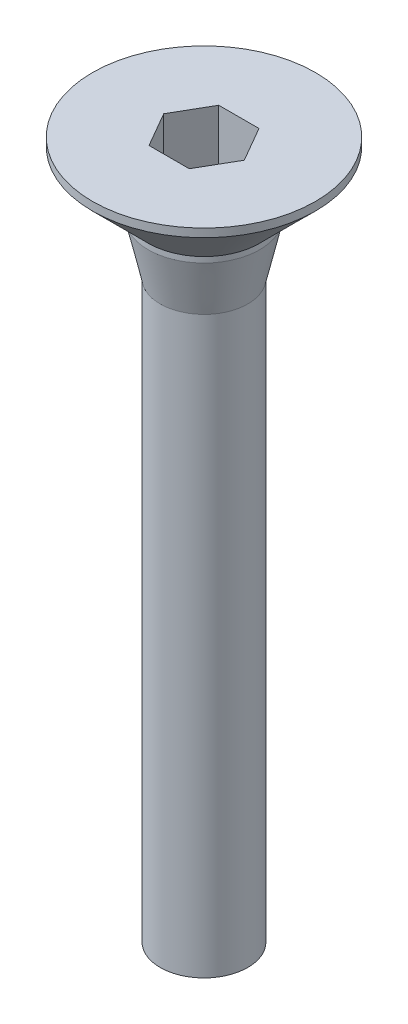
ISO-10303-21;
HEADER;
FILE_DESCRIPTION(('STEP AP214'),'2;1');
FILE_NAME('part.step','',(''),(''),'','','');
FILE_SCHEMA(('AUTOMOTIVE_DESIGN { 1 0 10303 214 1 1 1 1 }'));
ENDSEC;
DATA;
#1=APPLICATION_CONTEXT('core data for automotive mechanical design processes');
#2=APPLICATION_PROTOCOL_DEFINITION('international standard','automotive_design',2000,#1);
#3=PRODUCT_CONTEXT('',#1,'mechanical');
#4=PRODUCT('Part','Part','',(#3));
#5=PRODUCT_RELATED_PRODUCT_CATEGORY('part','',(#4));
#6=PRODUCT_DEFINITION_FORMATION('','',#4);
#7=PRODUCT_DEFINITION_CONTEXT('part definition',#1,'design');
#8=PRODUCT_DEFINITION('design','',#6,#7);
#9=PRODUCT_DEFINITION_SHAPE('','',#8);
#10=(LENGTH_UNIT() NAMED_UNIT(*) SI_UNIT(.MILLI.,.METRE.));
#11=(NAMED_UNIT(*) PLANE_ANGLE_UNIT() SI_UNIT($,.RADIAN.));
#12=(NAMED_UNIT(*) SI_UNIT($,.STERADIAN.) SOLID_ANGLE_UNIT());
#13=UNCERTAINTY_MEASURE_WITH_UNIT(LENGTH_MEASURE(1.E-05),#10,'distance_accuracy_value','');
#14=(GEOMETRIC_REPRESENTATION_CONTEXT(3) GLOBAL_UNCERTAINTY_ASSIGNED_CONTEXT((#13)) GLOBAL_UNIT_ASSIGNED_CONTEXT((#10,
#11,#12)) REPRESENTATION_CONTEXT('',''));
#15=CARTESIAN_POINT('',(0.,0.,0.));
#16=DIRECTION('',(0.,0.,1.));
#17=DIRECTION('',(1.,0.,0.));
#18=AXIS2_PLACEMENT_3D('',#15,#16,#17);
#19=CARTESIAN_POINT('',(1.5705,-25.,0.));
#20=DIRECTION('',(0.,1.,0.));
#21=DIRECTION('',(-1.,0.,0.));
#22=AXIS2_PLACEMENT_3D('',#19,#20,#21);
#23=PLANE('',#22);
#24=CARTESIAN_POINT('',(0.,-25.,0.));
#25=DIRECTION('',(0.,1.,0.));
#26=DIRECTION('',(-1.,0.,0.));
#27=AXIS2_PLACEMENT_3D('',#24,#25,#26);
#28=CIRCLE('',#27,1.5705);
#29=CARTESIAN_POINT('',(-1.5705,-25.,0.));
#30=VERTEX_POINT('',#29);
#31=EDGE_CURVE('E11',#30,#30,#28,.T.);
#32=ORIENTED_EDGE('',*,*,#31,.F.);
#33=EDGE_LOOP('',(#32));
#34=FACE_BOUND('',#33,.T.);
#35=ADVANCED_FACE('F33',(#34),#23,.F.);
#36=CARTESIAN_POINT('',(0.,0.,0.));
#37=DIRECTION('',(0.,1.,0.));
#38=DIRECTION('',(-1.,0.,0.));
#39=AXIS2_PLACEMENT_3D('',#36,#37,#38);
#40=CYLINDRICAL_SURFACE('',#39,1.5705);
#41=CARTESIAN_POINT('',(0.,-4.4,0.));
#42=DIRECTION('',(0.,1.,0.));
#43=DIRECTION('',(-1.,0.,0.));
#44=AXIS2_PLACEMENT_3D('',#41,#42,#43);
#45=CIRCLE('',#44,1.5705);
#46=CARTESIAN_POINT('',(-1.5705,-4.4,0.));
#47=VERTEX_POINT('',#46);
#48=EDGE_CURVE('E40',#47,#47,#45,.T.);
#49=ORIENTED_EDGE('',*,*,#48,.F.);
#50=EDGE_LOOP('',(#49));
#51=FACE_BOUND('',#50,.T.);
#52=ORIENTED_EDGE('',*,*,#31,.T.);
#53=EDGE_LOOP('',(#52));
#54=FACE_BOUND('',#53,.T.);
#55=ADVANCED_FACE('F155',(#51,#54),#40,.T.);
#56=CARTESIAN_POINT('',(0.,-4.4,0.));
#57=DIRECTION('',(0.,1.,0.));
#58=DIRECTION('',(-1.,0.,0.));
#59=AXIS2_PLACEMENT_3D('',#56,#57,#58);
#60=CONICAL_SURFACE('',#59,1.5705,0.222316126094133);
#61=CARTESIAN_POINT('',(0.,-2.5,0.));
#62=DIRECTION('',(0.,1.,0.));
#63=DIRECTION('',(-1.,0.,0.));
#64=AXIS2_PLACEMENT_3D('',#61,#62,#63);
#65=CIRCLE('',#64,2.);
#66=CARTESIAN_POINT('',(-2.,-2.5,0.));
#67=VERTEX_POINT('',#66);
#68=EDGE_CURVE('E148',#67,#67,#65,.T.);
#69=ORIENTED_EDGE('',*,*,#68,.F.);
#70=EDGE_LOOP('',(#69));
#71=FACE_BOUND('',#70,.T.);
#72=ORIENTED_EDGE('',*,*,#48,.T.);
#73=EDGE_LOOP('',(#72));
#74=FACE_BOUND('',#73,.T.);
#75=ADVANCED_FACE('F153',(#71,#74),#60,.T.);
#76=CARTESIAN_POINT('',(0.,0.,0.));
#77=DIRECTION('',(0.,1.,0.));
#78=DIRECTION('',(-1.,0.,0.));
#79=AXIS2_PLACEMENT_3D('',#76,#77,#78);
#80=CYLINDRICAL_SURFACE('',#79,2.);
#81=CARTESIAN_POINT('',(0.,-2.3,0.));
#82=DIRECTION('',(0.,1.,0.));
#83=DIRECTION('',(-1.,0.,0.));
#84=AXIS2_PLACEMENT_3D('',#81,#82,#83);
#85=CIRCLE('',#84,2.);
#86=CARTESIAN_POINT('',(-2.,-2.3,0.));
#87=VERTEX_POINT('',#86);
#88=EDGE_CURVE('E145',#87,#87,#85,.T.);
#89=ORIENTED_EDGE('',*,*,#88,.F.);
#90=EDGE_LOOP('',(#89));
#91=FACE_BOUND('',#90,.T.);
#92=ORIENTED_EDGE('',*,*,#68,.T.);
#93=EDGE_LOOP('',(#92));
#94=FACE_BOUND('',#93,.T.);
#95=ADVANCED_FACE('F173',(#91,#94),#80,.T.);
#96=CARTESIAN_POINT('',(0.,-2.3,0.));
#97=DIRECTION('',(0.,1.,0.));
#98=DIRECTION('',(-1.,0.,0.));
#99=AXIS2_PLACEMENT_3D('',#96,#97,#98);
#100=CONICAL_SURFACE('',#99,2.,0.785398163397442);
#101=CARTESIAN_POINT('',(0.,-0.299999999999975,0.));
#102=DIRECTION('',(0.,1.,0.));
#103=DIRECTION('',(-1.,0.,0.));
#104=AXIS2_PLACEMENT_3D('',#101,#102,#103);
#105=CIRCLE('',#104,4.);
#106=CARTESIAN_POINT('',(-4.,-0.299999999999976,0.));
#107=VERTEX_POINT('',#106);
#108=EDGE_CURVE('E142',#107,#107,#105,.T.);
#109=ORIENTED_EDGE('',*,*,#108,.F.);
#110=EDGE_LOOP('',(#109));
#111=FACE_BOUND('',#110,.T.);
#112=ORIENTED_EDGE('',*,*,#88,.T.);
#113=EDGE_LOOP('',(#112));
#114=FACE_BOUND('',#113,.T.);
#115=ADVANCED_FACE('F181',(#111,#114),#100,.T.);
#116=CARTESIAN_POINT('',(0.,0.,0.));
#117=DIRECTION('',(0.,1.,0.));
#118=DIRECTION('',(-1.,0.,0.));
#119=AXIS2_PLACEMENT_3D('',#116,#117,#118);
#120=CYLINDRICAL_SURFACE('',#119,4.);
#121=CARTESIAN_POINT('',(0.,0.,0.));
#122=DIRECTION('',(0.,1.,0.));
#123=DIRECTION('',(-1.,0.,0.));
#124=AXIS2_PLACEMENT_3D('',#121,#122,#123);
#125=CIRCLE('',#124,4.);
#126=CARTESIAN_POINT('',(-4.,0.,0.));
#127=VERTEX_POINT('',#126);
#128=EDGE_CURVE('E134',#127,#127,#125,.T.);
#129=ORIENTED_EDGE('',*,*,#128,.F.);
#130=EDGE_LOOP('',(#129));
#131=FACE_BOUND('',#130,.T.);
#132=ORIENTED_EDGE('',*,*,#108,.T.);
#133=EDGE_LOOP('',(#132));
#134=FACE_BOUND('',#133,.T.);
#135=ADVANCED_FACE('F189',(#131,#134),#120,.T.);
#136=CARTESIAN_POINT('',(0.,0.,0.));
#137=DIRECTION('',(0.,-1.,0.));
#138=DIRECTION('',(1.,0.,0.));
#139=AXIS2_PLACEMENT_3D('',#136,#137,#138);
#140=PLANE('',#139);
#141=DIRECTION('',(1.,0.,0.));
#142=VECTOR('',#141,1.);
#143=CARTESIAN_POINT('',(-0.721687836487031,0.,1.25));
#144=LINE('',#143,#142);
#145=CARTESIAN_POINT('',(-0.721687836487031,0.,1.25));
#146=VERTEX_POINT('',#145);
#147=CARTESIAN_POINT('',(0.721687836487031,0.,1.25));
#148=VERTEX_POINT('',#147);
#149=EDGE_CURVE('E121',#146,#148,#144,.T.);
#150=ORIENTED_EDGE('',*,*,#149,.F.);
#151=DIRECTION('',(0.499999999999998,0.,0.86602540378444));
#152=VECTOR('',#151,1.);
#153=CARTESIAN_POINT('',(-0.721687836487031,0.,1.25));
#154=LINE('',#153,#152);
#155=CARTESIAN_POINT('',(-1.44337567297406,0.,0.));
#156=VERTEX_POINT('',#155);
#157=EDGE_CURVE('E47',#156,#146,#154,.T.);
#158=ORIENTED_EDGE('',*,*,#157,.F.);
#159=DIRECTION('',(-0.499999999999998,0.,0.86602540378444));
#160=VECTOR('',#159,1.);
#161=CARTESIAN_POINT('',(-0.721687836487031,0.,-1.25));
#162=LINE('',#161,#160);
#163=CARTESIAN_POINT('',(-0.721687836487031,0.,-1.25));
#164=VERTEX_POINT('',#163);
#165=EDGE_CURVE('E130',#164,#156,#162,.T.);
#166=ORIENTED_EDGE('',*,*,#165,.F.);
#167=DIRECTION('',(-1.,0.,0.));
#168=VECTOR('',#167,1.);
#169=CARTESIAN_POINT('',(-0.721687836487031,0.,-1.25));
#170=LINE('',#169,#168);
#171=CARTESIAN_POINT('',(0.721687836487031,0.,-1.25));
#172=VERTEX_POINT('',#171);
#173=EDGE_CURVE('E128',#172,#164,#170,.T.);
#174=ORIENTED_EDGE('',*,*,#173,.F.);
#175=DIRECTION('',(-0.499999999999998,0.,-0.86602540378444));
#176=VECTOR('',#175,1.);
#177=CARTESIAN_POINT('',(0.721687836487031,0.,-1.25));
#178=LINE('',#177,#176);
#179=CARTESIAN_POINT('',(1.44337567297406,0.,0.));
#180=VERTEX_POINT('',#179);
#181=EDGE_CURVE('E95',#180,#172,#178,.T.);
#182=ORIENTED_EDGE('',*,*,#181,.F.);
#183=DIRECTION('',(0.499999999999998,0.,-0.86602540378444));
#184=VECTOR('',#183,1.);
#185=CARTESIAN_POINT('',(0.721687836487031,0.,1.25));
#186=LINE('',#185,#184);
#187=EDGE_CURVE('E124',#148,#180,#186,.T.);
#188=ORIENTED_EDGE('',*,*,#187,.F.);
#189=EDGE_LOOP('',(#150,#158,#166,#174,#182,#188));
#190=FACE_BOUND('',#189,.T.);
#191=ORIENTED_EDGE('',*,*,#128,.T.);
#192=EDGE_LOOP('',(#191));
#193=FACE_BOUND('',#192,.T.);
#194=ADVANCED_FACE('F197',(#190,#193),#140,.F.);
#195=CARTESIAN_POINT('',(-0.721687836487031,-5.3,1.25));
#196=DIRECTION('',(-0.86602540378444,0.,0.499999999999998));
#197=DIRECTION('',(0.499999999999998,0.,0.86602540378444));
#198=AXIS2_PLACEMENT_3D('',#195,#196,#197);
#199=PLANE('',#198);
#200=ORIENTED_EDGE('',*,*,#157,.T.);
#201=DIRECTION('',(0.,1.,0.));
#202=VECTOR('',#201,1.);
#203=CARTESIAN_POINT('',(-0.721687836487031,-5.3,1.25));
#204=LINE('',#203,#202);
#205=CARTESIAN_POINT('',(-0.721687836487031,-5.3,1.25));
#206=VERTEX_POINT('',#205);
#207=EDGE_CURVE('E77',#206,#146,#204,.T.);
#208=ORIENTED_EDGE('',*,*,#207,.F.);
#209=DIRECTION('',(0.499999999999998,0.,0.86602540378444));
#210=VECTOR('',#209,1.);
#211=CARTESIAN_POINT('',(-0.721687836487031,-5.3,1.25));
#212=LINE('',#211,#210);
#213=CARTESIAN_POINT('',(-1.44337567297406,-5.3,0.));
#214=VERTEX_POINT('',#213);
#215=EDGE_CURVE('E132',#214,#206,#212,.T.);
#216=ORIENTED_EDGE('',*,*,#215,.F.);
#217=DIRECTION('',(0.,1.,0.));
#218=VECTOR('',#217,1.);
#219=CARTESIAN_POINT('',(-1.44337567297406,-5.3,0.));
#220=LINE('',#219,#218);
#221=EDGE_CURVE('E55',#214,#156,#220,.T.);
#222=ORIENTED_EDGE('',*,*,#221,.T.);
#223=EDGE_LOOP('',(#200,#208,#216,#222));
#224=FACE_BOUND('',#223,.T.);
#225=ADVANCED_FACE('F205',(#224),#199,.F.);
#226=CARTESIAN_POINT('',(-0.721687836487031,-5.3,-1.25));
#227=DIRECTION('',(-0.86602540378444,0.,-0.499999999999998));
#228=DIRECTION('',(-0.499999999999998,0.,0.86602540378444));
#229=AXIS2_PLACEMENT_3D('',#226,#227,#228);
#230=PLANE('',#229);
#231=ORIENTED_EDGE('',*,*,#165,.T.);
#232=ORIENTED_EDGE('',*,*,#221,.F.);
#233=DIRECTION('',(-0.499999999999998,0.,0.86602540378444));
#234=VECTOR('',#233,1.);
#235=CARTESIAN_POINT('',(-0.721687836487031,-5.3,-1.25));
#236=LINE('',#235,#234);
#237=CARTESIAN_POINT('',(-0.721687836487031,-5.3,-1.25));
#238=VERTEX_POINT('',#237);
#239=EDGE_CURVE('E107',#238,#214,#236,.T.);
#240=ORIENTED_EDGE('',*,*,#239,.F.);
#241=DIRECTION('',(0.,1.,0.));
#242=VECTOR('',#241,1.);
#243=CARTESIAN_POINT('',(-0.721687836487031,-5.3,-1.25));
#244=LINE('',#243,#242);
#245=EDGE_CURVE('E99',#238,#164,#244,.T.);
#246=ORIENTED_EDGE('',*,*,#245,.T.);
#247=EDGE_LOOP('',(#231,#232,#240,#246));
#248=FACE_BOUND('',#247,.T.);
#249=ADVANCED_FACE('F213',(#248),#230,.F.);
#250=CARTESIAN_POINT('',(-0.721687836487031,-5.3,-1.25));
#251=DIRECTION('',(0.,0.,-1.));
#252=DIRECTION('',(-1.,0.,0.));
#253=AXIS2_PLACEMENT_3D('',#250,#251,#252);
#254=PLANE('',#253);
#255=ORIENTED_EDGE('',*,*,#173,.T.);
#256=ORIENTED_EDGE('',*,*,#245,.F.);
#257=DIRECTION('',(-1.,0.,0.));
#258=VECTOR('',#257,1.);
#259=CARTESIAN_POINT('',(-0.721687836487031,-5.3,-1.25));
#260=LINE('',#259,#258);
#261=CARTESIAN_POINT('',(0.721687836487031,-5.3,-1.25));
#262=VERTEX_POINT('',#261);
#263=EDGE_CURVE('E103',#262,#238,#260,.T.);
#264=ORIENTED_EDGE('',*,*,#263,.F.);
#265=DIRECTION('',(0.,1.,0.));
#266=VECTOR('',#265,1.);
#267=CARTESIAN_POINT('',(0.721687836487031,-5.3,-1.25));
#268=LINE('',#267,#266);
#269=EDGE_CURVE('E88',#262,#172,#268,.T.);
#270=ORIENTED_EDGE('',*,*,#269,.T.);
#271=EDGE_LOOP('',(#255,#256,#264,#270));
#272=FACE_BOUND('',#271,.T.);
#273=ADVANCED_FACE('F104',(#272),#254,.F.);
#274=CARTESIAN_POINT('',(0.721687836487031,-5.3,-1.25));
#275=DIRECTION('',(0.86602540378444,0.,-0.499999999999998));
#276=DIRECTION('',(-0.499999999999998,0.,-0.86602540378444));
#277=AXIS2_PLACEMENT_3D('',#274,#275,#276);
#278=PLANE('',#277);
#279=ORIENTED_EDGE('',*,*,#181,.T.);
#280=ORIENTED_EDGE('',*,*,#269,.F.);
#281=DIRECTION('',(-0.499999999999998,0.,-0.86602540378444));
#282=VECTOR('',#281,1.);
#283=CARTESIAN_POINT('',(0.721687836487031,-5.3,-1.25));
#284=LINE('',#283,#282);
#285=CARTESIAN_POINT('',(1.44337567297406,-5.3,0.));
#286=VERTEX_POINT('',#285);
#287=EDGE_CURVE('E92',#286,#262,#284,.T.);
#288=ORIENTED_EDGE('',*,*,#287,.F.);
#289=DIRECTION('',(0.,1.,0.));
#290=VECTOR('',#289,1.);
#291=CARTESIAN_POINT('',(1.44337567297406,-5.3,0.));
#292=LINE('',#291,#290);
#293=EDGE_CURVE('E100',#286,#180,#292,.T.);
#294=ORIENTED_EDGE('',*,*,#293,.T.);
#295=EDGE_LOOP('',(#279,#280,#288,#294));
#296=FACE_BOUND('',#295,.T.);
#297=ADVANCED_FACE('F90',(#296),#278,.F.);
#298=CARTESIAN_POINT('',(0.721687836487031,-5.3,1.25));
#299=DIRECTION('',(0.86602540378444,0.,0.499999999999998));
#300=DIRECTION('',(0.499999999999998,0.,-0.86602540378444));
#301=AXIS2_PLACEMENT_3D('',#298,#299,#300);
#302=PLANE('',#301);
#303=ORIENTED_EDGE('',*,*,#187,.T.);
#304=ORIENTED_EDGE('',*,*,#293,.F.);
#305=DIRECTION('',(0.499999999999998,0.,-0.86602540378444));
#306=VECTOR('',#305,1.);
#307=CARTESIAN_POINT('',(0.721687836487031,-5.3,1.25));
#308=LINE('',#307,#306);
#309=CARTESIAN_POINT('',(0.721687836487031,-5.3,1.25));
#310=VERTEX_POINT('',#309);
#311=EDGE_CURVE('E113',#310,#286,#308,.T.);
#312=ORIENTED_EDGE('',*,*,#311,.F.);
#313=DIRECTION('',(0.,1.,0.));
#314=VECTOR('',#313,1.);
#315=CARTESIAN_POINT('',(0.721687836487031,-5.3,1.25));
#316=LINE('',#315,#314);
#317=EDGE_CURVE('E137',#310,#148,#316,.T.);
#318=ORIENTED_EDGE('',*,*,#317,.T.);
#319=EDGE_LOOP('',(#303,#304,#312,#318));
#320=FACE_BOUND('',#319,.T.);
#321=ADVANCED_FACE('F232',(#320),#302,.F.);
#322=CARTESIAN_POINT('',(-0.721687836487031,-5.3,1.25));
#323=DIRECTION('',(0.,0.,1.));
#324=DIRECTION('',(1.,0.,0.));
#325=AXIS2_PLACEMENT_3D('',#322,#323,#324);
#326=PLANE('',#325);
#327=ORIENTED_EDGE('',*,*,#149,.T.);
#328=ORIENTED_EDGE('',*,*,#317,.F.);
#329=DIRECTION('',(1.,0.,0.));
#330=VECTOR('',#329,1.);
#331=CARTESIAN_POINT('',(-0.721687836487031,-5.3,1.25));
#332=LINE('',#331,#330);
#333=EDGE_CURVE('E115',#206,#310,#332,.T.);
#334=ORIENTED_EDGE('',*,*,#333,.F.);
#335=ORIENTED_EDGE('',*,*,#207,.T.);
#336=EDGE_LOOP('',(#327,#328,#334,#335));
#337=FACE_BOUND('',#336,.T.);
#338=ADVANCED_FACE('F239',(#337),#326,.F.);
#339=CARTESIAN_POINT('',(-0.721687836487031,-5.3,1.25));
#340=DIRECTION('',(0.,-1.,0.));
#341=DIRECTION('',(0.,0.,-1.));
#342=AXIS2_PLACEMENT_3D('',#339,#340,#341);
#343=PLANE('',#342);
#344=ORIENTED_EDGE('',*,*,#215,.T.);
#345=ORIENTED_EDGE('',*,*,#333,.T.);
#346=ORIENTED_EDGE('',*,*,#311,.T.);
#347=ORIENTED_EDGE('',*,*,#287,.T.);
#348=ORIENTED_EDGE('',*,*,#263,.T.);
#349=ORIENTED_EDGE('',*,*,#239,.T.);
#350=EDGE_LOOP('',(#344,#345,#346,#347,#348,#349));
#351=FACE_BOUND('',#350,.T.);
#352=ADVANCED_FACE('F110',(#351),#343,.F.);
#353=CLOSED_SHELL('',(#35,#55,#75,#95,#115,#135,#194,#225,#249,#273,#297,#321,#338,#352));
#354=MANIFOLD_SOLID_BREP('B2',#353);
#355=ADVANCED_BREP_SHAPE_REPRESENTATION('',(#18,#354),#14);
#356=SHAPE_DEFINITION_REPRESENTATION(#9,#355);
ENDSEC;
END-ISO-10303-21;
